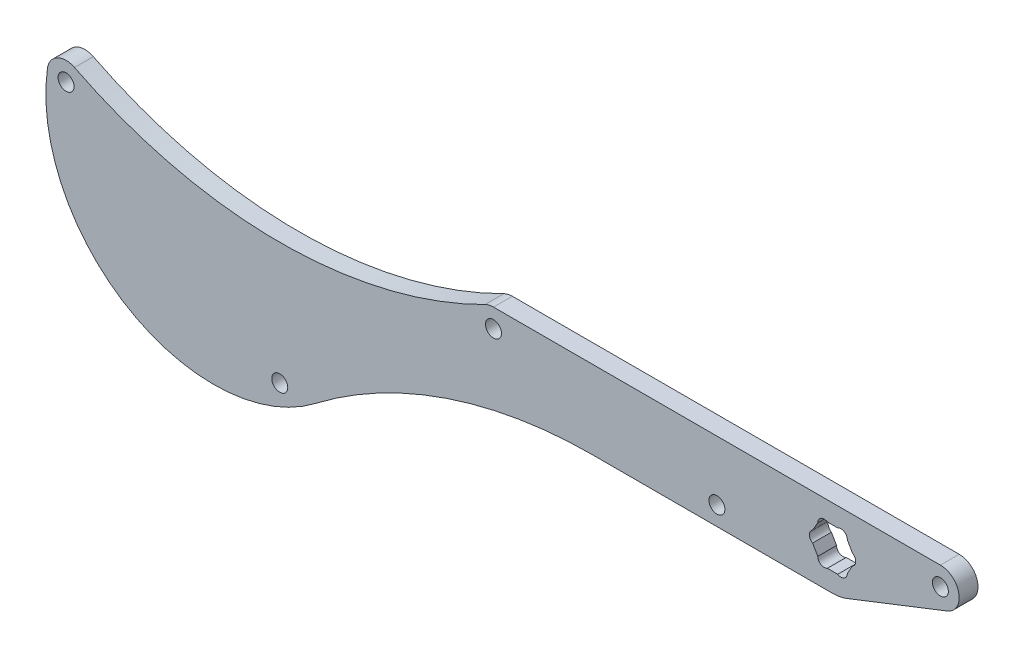
ISO-10303-21;
HEADER;
FILE_DESCRIPTION(('STEP AP214'),'2;1');
FILE_NAME('part.step','',(''),(''),'','','');
FILE_SCHEMA(('AUTOMOTIVE_DESIGN { 1 0 10303 214 1 1 1 1 }'));
ENDSEC;
DATA;
#1=APPLICATION_CONTEXT('core data for automotive mechanical design processes');
#2=APPLICATION_PROTOCOL_DEFINITION('international standard','automotive_design',2000,#1);
#3=PRODUCT_CONTEXT('',#1,'mechanical');
#4=PRODUCT('Part','Part','',(#3));
#5=PRODUCT_RELATED_PRODUCT_CATEGORY('part','',(#4));
#6=PRODUCT_DEFINITION_FORMATION('','',#4);
#7=PRODUCT_DEFINITION_CONTEXT('part definition',#1,'design');
#8=PRODUCT_DEFINITION('design','',#6,#7);
#9=PRODUCT_DEFINITION_SHAPE('','',#8);
#10=(LENGTH_UNIT() NAMED_UNIT(*) SI_UNIT(.MILLI.,.METRE.));
#11=(NAMED_UNIT(*) PLANE_ANGLE_UNIT() SI_UNIT($,.RADIAN.));
#12=(NAMED_UNIT(*) SI_UNIT($,.STERADIAN.) SOLID_ANGLE_UNIT());
#13=UNCERTAINTY_MEASURE_WITH_UNIT(LENGTH_MEASURE(1.E-05),#10,'distance_accuracy_value','');
#14=(GEOMETRIC_REPRESENTATION_CONTEXT(3) GLOBAL_UNCERTAINTY_ASSIGNED_CONTEXT((#13)) GLOBAL_UNIT_ASSIGNED_CONTEXT((#10,
#11,#12)) REPRESENTATION_CONTEXT('',''));
#15=CARTESIAN_POINT('',(0.,0.,0.));
#16=DIRECTION('',(0.,0.,1.));
#17=DIRECTION('',(1.,0.,0.));
#18=AXIS2_PLACEMENT_3D('',#15,#16,#17);
#19=CARTESIAN_POINT('',(89.2636544176856,6.5,-7.5));
#20=DIRECTION('',(0.,0.,1.));
#21=DIRECTION('',(1.,0.,0.));
#22=AXIS2_PLACEMENT_3D('',#19,#20,#21);
#23=PLANE('',#22);
#24=CARTESIAN_POINT('',(192.059712140447,0.,-7.5));
#25=DIRECTION('',(0.,0.,1.));
#26=DIRECTION('',(1.,0.,0.));
#27=AXIS2_PLACEMENT_3D('',#24,#25,#26);
#28=CIRCLE('',#27,2.05000000000001);
#29=CARTESIAN_POINT('',(191.034712140447,1.77535207775811,-7.5));
#30=VERTEX_POINT('',#29);
#31=CARTESIAN_POINT('',(191.034712140447,-1.77535207775809,-7.5));
#32=VERTEX_POINT('',#31);
#33=EDGE_CURVE('E47',#30,#32,#28,.T.);
#34=ORIENTED_EDGE('',*,*,#33,.F.);
#35=DIRECTION('',(-0.500000000000005,-0.866025403784436,0.));
#36=VECTOR('',#35,1.);
#37=CARTESIAN_POINT('',(191.034712140447,1.77535207775811,-7.5));
#38=LINE('',#37,#36);
#39=CARTESIAN_POINT('',(192.679753863261,4.62464792224191,-7.5));
#40=VERTEX_POINT('',#39);
#41=EDGE_CURVE('E226',#40,#30,#38,.T.);
#42=ORIENTED_EDGE('',*,*,#41,.F.);
#43=CARTESIAN_POINT('',(194.729753863261,4.62464792224189,-7.5));
#44=DIRECTION('',(0.,0.,1.));
#45=DIRECTION('',(1.,0.,0.));
#46=AXIS2_PLACEMENT_3D('',#43,#44,#45);
#47=CIRCLE('',#46,2.05);
#48=CARTESIAN_POINT('',(195.754753863261,6.39999999999998,-7.5));
#49=VERTEX_POINT('',#48);
#50=EDGE_CURVE('E223',#49,#40,#47,.T.);
#51=ORIENTED_EDGE('',*,*,#50,.F.);
#52=DIRECTION('',(-1.,0.,0.));
#53=VECTOR('',#52,1.);
#54=CARTESIAN_POINT('',(195.754753863261,6.39999999999999,-7.5));
#55=LINE('',#54,#53);
#56=CARTESIAN_POINT('',(199.044837308888,6.3999999999999,-7.5));
#57=VERTEX_POINT('',#56);
#58=EDGE_CURVE('E220',#57,#49,#55,.T.);
#59=ORIENTED_EDGE('',*,*,#58,.F.);
#60=CARTESIAN_POINT('',(200.069837308888,4.62464792224184,-7.5));
#61=DIRECTION('',(0.,0.,1.));
#62=DIRECTION('',(1.,0.,0.));
#63=AXIS2_PLACEMENT_3D('',#60,#61,#62);
#64=CIRCLE('',#63,2.04999999999998);
#65=CARTESIAN_POINT('',(202.119837308888,4.62464792224182,-7.5));
#66=VERTEX_POINT('',#65);
#67=EDGE_CURVE('E217',#66,#57,#64,.T.);
#68=ORIENTED_EDGE('',*,*,#67,.F.);
#69=DIRECTION('',(-0.499999999999968,0.866025403784457,0.));
#70=VECTOR('',#69,1.);
#71=CARTESIAN_POINT('',(202.119837308888,4.62464792224182,-7.5));
#72=LINE('',#71,#70);
#73=CARTESIAN_POINT('',(203.764879031701,1.77535207775793,-7.5));
#74=VERTEX_POINT('',#73);
#75=EDGE_CURVE('E214',#74,#66,#72,.T.);
#76=ORIENTED_EDGE('',*,*,#75,.F.);
#77=CARTESIAN_POINT('',(202.739879031701,-1.02517827788429E-13,-7.5));
#78=DIRECTION('',(0.,0.,1.));
#79=DIRECTION('',(1.,0.,0.));
#80=AXIS2_PLACEMENT_3D('',#77,#78,#79);
#81=CIRCLE('',#80,2.04999999999995);
#82=CARTESIAN_POINT('',(203.764879031701,-1.77535207775818,-7.5));
#83=VERTEX_POINT('',#82);
#84=EDGE_CURVE('E211',#83,#74,#81,.T.);
#85=ORIENTED_EDGE('',*,*,#84,.F.);
#86=DIRECTION('',(0.500000000000029,0.866025403784422,0.));
#87=VECTOR('',#86,1.);
#88=CARTESIAN_POINT('',(203.764879031701,-1.77535207775822,-7.5));
#89=LINE('',#88,#87);
#90=CARTESIAN_POINT('',(202.119837308888,-4.62464792224203,-7.5));
#91=VERTEX_POINT('',#90);
#92=EDGE_CURVE('E208',#91,#83,#89,.T.);
#93=ORIENTED_EDGE('',*,*,#92,.F.);
#94=CARTESIAN_POINT('',(200.069837308888,-4.62464792224197,-7.5));
#95=DIRECTION('',(0.,0.,1.));
#96=DIRECTION('',(1.,0.,0.));
#97=AXIS2_PLACEMENT_3D('',#94,#95,#96);
#98=CIRCLE('',#97,2.04999999999996);
#99=CARTESIAN_POINT('',(199.044837308888,-6.40000000000002,-7.5));
#100=VERTEX_POINT('',#99);
#101=EDGE_CURVE('E202',#100,#91,#98,.T.);
#102=ORIENTED_EDGE('',*,*,#101,.F.);
#103=DIRECTION('',(1.,0.,0.));
#104=VECTOR('',#103,1.);
#105=CARTESIAN_POINT('',(199.044837308888,-6.40000000000006,-7.5));
#106=LINE('',#105,#104);
#107=CARTESIAN_POINT('',(195.754753863261,-6.40000000000002,-7.5));
#108=VERTEX_POINT('',#107);
#109=EDGE_CURVE('E200',#108,#100,#106,.T.);
#110=ORIENTED_EDGE('',*,*,#109,.F.);
#111=CARTESIAN_POINT('',(194.729753863261,-4.62464792224188,-7.5));
#112=DIRECTION('',(0.,0.,1.));
#113=DIRECTION('',(1.,0.,0.));
#114=AXIS2_PLACEMENT_3D('',#111,#112,#113);
#115=CIRCLE('',#114,2.04999999999999);
#116=CARTESIAN_POINT('',(192.679753863261,-4.62464792224185,-7.5));
#117=VERTEX_POINT('',#116);
#118=EDGE_CURVE('E184',#117,#108,#115,.T.);
#119=ORIENTED_EDGE('',*,*,#118,.F.);
#120=DIRECTION('',(0.499999999999992,-0.866025403784443,0.));
#121=VECTOR('',#120,1.);
#122=CARTESIAN_POINT('',(192.679753863261,-4.62464792224185,-7.5));
#123=LINE('',#122,#121);
#124=EDGE_CURVE('E193',#32,#117,#123,.T.);
#125=ORIENTED_EDGE('',*,*,#124,.F.);
#126=EDGE_LOOP('',(#34,#42,#51,#59,#68,#76,#85,#93,#102,#110,#119,#125));
#127=FACE_BOUND('',#126,.T.);
#128=CARTESIAN_POINT('',(21.1052464968056,-42.5537139426052,-7.5));
#129=DIRECTION('',(0.,0.,1.));
#130=DIRECTION('',(1.,0.,0.));
#131=AXIS2_PLACEMENT_3D('',#128,#129,#130);
#132=CIRCLE('',#131,2.54999999315467);
#133=CARTESIAN_POINT('',(23.6552464899603,-42.5537139426052,-7.5));
#134=VERTEX_POINT('',#133);
#135=EDGE_CURVE('E262',#134,#134,#132,.T.);
#136=ORIENTED_EDGE('',*,*,#135,.F.);
#137=EDGE_LOOP('',(#136));
#138=FACE_BOUND('',#137,.T.);
#139=CARTESIAN_POINT('',(160.527291290898,-6.5,-7.5));
#140=DIRECTION('',(0.,0.,1.));
#141=DIRECTION('',(1.,0.,0.));
#142=AXIS2_PLACEMENT_3D('',#139,#140,#141);
#143=CIRCLE('',#142,2.54999999999999);
#144=CARTESIAN_POINT('',(163.077291290898,-6.5,-7.5));
#145=VERTEX_POINT('',#144);
#146=EDGE_CURVE('E274',#145,#145,#143,.T.);
#147=ORIENTED_EDGE('',*,*,#146,.F.);
#148=EDGE_LOOP('',(#147));
#149=FACE_BOUND('',#148,.T.);
#150=DIRECTION('',(-1.,0.,0.));
#151=VECTOR('',#150,1.);
#152=CARTESIAN_POINT('',(231.79092816411,12.5,-7.5));
#153=LINE('',#152,#151);
#154=CARTESIAN_POINT('',(231.79092816411,12.5,-7.5));
#155=VERTEX_POINT('',#154);
#156=CARTESIAN_POINT('',(89.2636544176856,12.5,-7.5));
#157=VERTEX_POINT('',#156);
#158=EDGE_CURVE('E280',#155,#157,#153,.T.);
#159=ORIENTED_EDGE('',*,*,#158,.T.);
#160=CARTESIAN_POINT('',(89.2636544176856,6.5,-7.5));
#161=DIRECTION('',(0.,0.,1.));
#162=DIRECTION('',(1.,0.,0.));
#163=AXIS2_PLACEMENT_3D('',#160,#161,#162);
#164=CIRCLE('',#163,5.99999999999999);
#165=CARTESIAN_POINT('',(86.564070557482,11.8583810037854,-7.5));
#166=VERTEX_POINT('',#165);
#167=EDGE_CURVE('E282',#157,#166,#164,.T.);
#168=ORIENTED_EDGE('',*,*,#167,.T.);
#169=CARTESIAN_POINT('',(21.1052464968056,141.787043175593,-7.5));
#170=DIRECTION('',(0.,0.,-1.));
#171=DIRECTION('',(1.,0.,0.));
#172=AXIS2_PLACEMENT_3D('',#169,#170,#171);
#173=CIRCLE('',#172,145.486476695129);
#174=CARTESIAN_POINT('',(-44.3535775638708,11.8583810037854,-7.5));
#175=VERTEX_POINT('',#174);
#176=EDGE_CURVE('E285',#166,#175,#173,.T.);
#177=ORIENTED_EDGE('',*,*,#176,.T.);
#178=CARTESIAN_POINT('',(-47.0531614240743,6.50000000000001,-7.5));
#179=DIRECTION('',(0.,0.,1.));
#180=DIRECTION('',(1.,0.,0.));
#181=AXIS2_PLACEMENT_3D('',#178,#179,#180);
#182=CIRCLE('',#181,5.99999999999999);
#183=CARTESIAN_POINT('',(-52.996718656589,7.32105263157895,-7.5));
#184=VERTEX_POINT('',#183);
#185=EDGE_CURVE('E287',#175,#184,#182,.T.);
#186=ORIENTED_EDGE('',*,*,#185,.T.);
#187=CARTESIAN_POINT('',(0.,0.,-7.5));
#188=DIRECTION('',(0.,0.,1.));
#189=DIRECTION('',(1.,0.,0.));
#190=AXIS2_PLACEMENT_3D('',#187,#188,#189);
#191=CIRCLE('',#190,53.5);
#192=CARTESIAN_POINT('',(32.5266850271321,-42.4766378277017,-7.5));
#193=VERTEX_POINT('',#192);
#194=EDGE_CURVE('E289',#184,#193,#191,.T.);
#195=ORIENTED_EDGE('',*,*,#194,.T.);
#196=CARTESIAN_POINT('',(120.978886955537,-157.986476695129,-7.5));
#197=DIRECTION('',(0.,0.,-1.));
#198=DIRECTION('',(1.,0.,0.));
#199=AXIS2_PLACEMENT_3D('',#196,#197,#198);
#200=CIRCLE('',#199,145.486476695129);
#201=CARTESIAN_POINT('',(120.978886955537,-12.5,-7.5));
#202=VERTEX_POINT('',#201);
#203=EDGE_CURVE('E291',#193,#202,#200,.T.);
#204=ORIENTED_EDGE('',*,*,#203,.T.);
#205=DIRECTION('',(1.,0.,0.));
#206=VECTOR('',#205,1.);
#207=CARTESIAN_POINT('',(120.978886955537,-12.5,-7.5));
#208=LINE('',#207,#206);
#209=CARTESIAN_POINT('',(197.399795586074,-12.5,-7.5));
#210=VERTEX_POINT('',#209);
#211=EDGE_CURVE('E293',#202,#210,#208,.T.);
#212=ORIENTED_EDGE('',*,*,#211,.T.);
#213=CARTESIAN_POINT('',(197.399795586074,0.,-7.5));
#214=DIRECTION('',(0.,0.,1.));
#215=DIRECTION('',(1.,0.,0.));
#216=AXIS2_PLACEMENT_3D('',#213,#214,#215);
#217=CIRCLE('',#216,12.5);
#218=CARTESIAN_POINT('',(201.961884601528,-11.6377551020408,-7.5));
#219=VERTEX_POINT('',#218);
#220=EDGE_CURVE('E295',#210,#219,#217,.T.);
#221=ORIENTED_EDGE('',*,*,#220,.T.);
#222=DIRECTION('',(0.931020408163265,0.364967121236292,0.));
#223=VECTOR('',#222,1.);
#224=CARTESIAN_POINT('',(201.961884601528,-11.6377551020408,-7.5));
#225=LINE('',#224,#223);
#226=CARTESIAN_POINT('',(233.980730891527,0.913877551020389,-7.5));
#227=VERTEX_POINT('',#226);
#228=EDGE_CURVE('E297',#219,#227,#225,.T.);
#229=ORIENTED_EDGE('',*,*,#228,.T.);
#230=CARTESIAN_POINT('',(231.79092816411,6.5,-7.5));
#231=DIRECTION('',(0.,0.,1.));
#232=DIRECTION('',(1.,0.,0.));
#233=AXIS2_PLACEMENT_3D('',#230,#231,#232);
#234=CIRCLE('',#233,6.00000000000001);
#235=EDGE_CURVE('E299',#227,#155,#234,.T.);
#236=ORIENTED_EDGE('',*,*,#235,.T.);
#237=EDGE_LOOP('',(#159,#168,#177,#186,#195,#204,#212,#221,#229,#236));
#238=FACE_BOUND('',#237,.T.);
#239=CARTESIAN_POINT('',(89.2636544176856,6.5,-7.5));
#240=DIRECTION('',(0.,0.,1.));
#241=DIRECTION('',(1.,0.,0.));
#242=AXIS2_PLACEMENT_3D('',#239,#240,#241);
#243=CIRCLE('',#242,2.54999999315466);
#244=CARTESIAN_POINT('',(91.8136544108403,6.5,-7.5));
#245=VERTEX_POINT('',#244);
#246=EDGE_CURVE('E268',#245,#245,#243,.T.);
#247=ORIENTED_EDGE('',*,*,#246,.F.);
#248=EDGE_LOOP('',(#247));
#249=FACE_BOUND('',#248,.T.);
#250=CARTESIAN_POINT('',(-47.0531614240743,6.50000000000001,-7.5));
#251=DIRECTION('',(0.,0.,1.));
#252=DIRECTION('',(1.,0.,0.));
#253=AXIS2_PLACEMENT_3D('',#250,#251,#252);
#254=CIRCLE('',#253,2.55);
#255=CARTESIAN_POINT('',(-44.5031614240743,6.50000000000001,-7.5));
#256=VERTEX_POINT('',#255);
#257=EDGE_CURVE('E256',#256,#256,#254,.T.);
#258=ORIENTED_EDGE('',*,*,#257,.F.);
#259=EDGE_LOOP('',(#258));
#260=FACE_BOUND('',#259,.T.);
#261=CARTESIAN_POINT('',(231.79092816411,6.5,-7.5));
#262=DIRECTION('',(0.,0.,1.));
#263=DIRECTION('',(1.,0.,0.));
#264=AXIS2_PLACEMENT_3D('',#261,#262,#263);
#265=CIRCLE('',#264,2.54999999999999);
#266=CARTESIAN_POINT('',(234.34092816411,6.5,-7.5));
#267=VERTEX_POINT('',#266);
#268=EDGE_CURVE('E250',#267,#267,#265,.T.);
#269=ORIENTED_EDGE('',*,*,#268,.F.);
#270=EDGE_LOOP('',(#269));
#271=FACE_BOUND('',#270,.T.);
#272=ADVANCED_FACE('F32',(#127,#138,#149,#238,#249,#260,#271),#23,.T.);
#273=CARTESIAN_POINT('',(89.2636544176856,6.5,-13.5));
#274=DIRECTION('',(0.,0.,1.));
#275=DIRECTION('',(1.,0.,0.));
#276=AXIS2_PLACEMENT_3D('',#273,#274,#275);
#277=PLANE('',#276);
#278=DIRECTION('',(-0.500000000000005,-0.866025403784436,0.));
#279=VECTOR('',#278,1.);
#280=CARTESIAN_POINT('',(167.637780272056,-38.7493226595228,-13.5));
#281=LINE('',#280,#279);
#282=CARTESIAN_POINT('',(192.679753863261,4.62464792224191,-13.5));
#283=VERTEX_POINT('',#282);
#284=CARTESIAN_POINT('',(191.034712140447,1.77535207775811,-13.5));
#285=VERTEX_POINT('',#284);
#286=EDGE_CURVE('E40',#283,#285,#281,.T.);
#287=ORIENTED_EDGE('',*,*,#286,.T.);
#288=CARTESIAN_POINT('',(192.059712140447,0.,-13.5));
#289=DIRECTION('',(0.,0.,1.));
#290=DIRECTION('',(1.,0.,0.));
#291=AXIS2_PLACEMENT_3D('',#288,#289,#290);
#292=CIRCLE('',#291,2.05000000000001);
#293=CARTESIAN_POINT('',(191.034712140447,-1.77535207775809,-13.5));
#294=VERTEX_POINT('',#293);
#295=EDGE_CURVE('E11',#285,#294,#292,.T.);
#296=ORIENTED_EDGE('',*,*,#295,.T.);
#297=DIRECTION('',(0.499999999999992,-0.866025403784443,0.));
#298=VECTOR('',#297,1.);
#299=CARTESIAN_POINT('',(162.008615147458,48.499322659522,-13.5));
#300=LINE('',#299,#298);
#301=CARTESIAN_POINT('',(192.679753863261,-4.62464792224185,-13.5));
#302=VERTEX_POINT('',#301);
#303=EDGE_CURVE('E350',#294,#302,#300,.T.);
#304=ORIENTED_EDGE('',*,*,#303,.T.);
#305=CARTESIAN_POINT('',(194.729753863261,-4.62464792224188,-13.5));
#306=DIRECTION('',(0.,0.,1.));
#307=DIRECTION('',(1.,0.,0.));
#308=AXIS2_PLACEMENT_3D('',#305,#306,#307);
#309=CIRCLE('',#308,2.04999999999999);
#310=CARTESIAN_POINT('',(195.754753863261,-6.40000000000002,-13.5));
#311=VERTEX_POINT('',#310);
#312=EDGE_CURVE('E187',#302,#311,#309,.T.);
#313=ORIENTED_EDGE('',*,*,#312,.T.);
#314=DIRECTION('',(1.,0.,0.));
#315=VECTOR('',#314,1.);
#316=CARTESIAN_POINT('',(89.2636544176855,-6.39999999999878,-13.5));
#317=LINE('',#316,#315);
#318=CARTESIAN_POINT('',(199.044837308888,-6.40000000000002,-13.5));
#319=VERTEX_POINT('',#318);
#320=EDGE_CURVE('E353',#311,#319,#317,.T.);
#321=ORIENTED_EDGE('',*,*,#320,.T.);
#322=CARTESIAN_POINT('',(200.069837308888,-4.62464792224197,-13.5));
#323=DIRECTION('',(0.,0.,1.));
#324=DIRECTION('',(1.,0.,0.));
#325=AXIS2_PLACEMENT_3D('',#322,#323,#324);
#326=CIRCLE('',#325,2.04999999999996);
#327=CARTESIAN_POINT('',(202.119837308888,-4.62464792224203,-13.5));
#328=VERTEX_POINT('',#327);
#329=EDGE_CURVE('E356',#319,#328,#326,.T.);
#330=ORIENTED_EDGE('',*,*,#329,.T.);
#331=DIRECTION('',(0.500000000000029,0.866025403784422,0.));
#332=VECTOR('',#331,1.);
#333=CARTESIAN_POINT('',(178.722905440494,-45.1493226595246,-13.5));
#334=LINE('',#333,#332);
#335=CARTESIAN_POINT('',(203.764879031701,-1.77535207775818,-13.5));
#336=VERTEX_POINT('',#335);
#337=EDGE_CURVE('E359',#328,#336,#334,.T.);
#338=ORIENTED_EDGE('',*,*,#337,.T.);
#339=CARTESIAN_POINT('',(202.739879031701,-1.02517827788429E-13,-13.5));
#340=DIRECTION('',(0.,0.,1.));
#341=DIRECTION('',(1.,0.,0.));
#342=AXIS2_PLACEMENT_3D('',#339,#340,#341);
#343=CIRCLE('',#342,2.04999999999995);
#344=CARTESIAN_POINT('',(203.764879031701,1.77535207775793,-13.5));
#345=VERTEX_POINT('',#344);
#346=EDGE_CURVE('E362',#336,#345,#343,.T.);
#347=ORIENTED_EDGE('',*,*,#346,.T.);
#348=DIRECTION('',(-0.499999999999968,0.866025403784457,0.));
#349=VECTOR('',#348,1.);
#350=CARTESIAN_POINT('',(173.093740315902,54.8993226595204,-13.5));
#351=LINE('',#350,#349);
#352=CARTESIAN_POINT('',(202.119837308888,4.62464792224182,-13.5));
#353=VERTEX_POINT('',#352);
#354=EDGE_CURVE('E365',#345,#353,#351,.T.);
#355=ORIENTED_EDGE('',*,*,#354,.T.);
#356=CARTESIAN_POINT('',(200.069837308888,4.62464792224184,-13.5));
#357=DIRECTION('',(0.,0.,1.));
#358=DIRECTION('',(1.,0.,0.));
#359=AXIS2_PLACEMENT_3D('',#356,#357,#358);
#360=CIRCLE('',#359,2.04999999999998);
#361=CARTESIAN_POINT('',(199.044837308888,6.3999999999999,-13.5));
#362=VERTEX_POINT('',#361);
#363=EDGE_CURVE('E368',#353,#362,#360,.T.);
#364=ORIENTED_EDGE('',*,*,#363,.T.);
#365=DIRECTION('',(-1.,0.,0.));
#366=VECTOR('',#365,1.);
#367=CARTESIAN_POINT('',(89.2636544176856,6.40000000000282,-13.5));
#368=LINE('',#367,#366);
#369=CARTESIAN_POINT('',(195.754753863261,6.39999999999998,-13.5));
#370=VERTEX_POINT('',#369);
#371=EDGE_CURVE('E371',#362,#370,#368,.T.);
#372=ORIENTED_EDGE('',*,*,#371,.T.);
#373=CARTESIAN_POINT('',(194.729753863261,4.62464792224189,-13.5));
#374=DIRECTION('',(0.,0.,1.));
#375=DIRECTION('',(1.,0.,0.));
#376=AXIS2_PLACEMENT_3D('',#373,#374,#375);
#377=CIRCLE('',#376,2.05);
#378=EDGE_CURVE('E374',#370,#283,#377,.T.);
#379=ORIENTED_EDGE('',*,*,#378,.T.);
#380=EDGE_LOOP('',(#287,#296,#304,#313,#321,#330,#338,#347,#355,#364,#372,#379));
#381=FACE_BOUND('',#380,.T.);
#382=DIRECTION('',(-1.,0.,0.));
#383=VECTOR('',#382,1.);
#384=CARTESIAN_POINT('',(197.399795586074,12.5,-13.5));
#385=LINE('',#384,#383);
#386=CARTESIAN_POINT('',(231.79092816411,12.5,-13.5));
#387=VERTEX_POINT('',#386);
#388=CARTESIAN_POINT('',(89.2636544176856,12.5,-13.5));
#389=VERTEX_POINT('',#388);
#390=EDGE_CURVE('E277',#387,#389,#385,.T.);
#391=ORIENTED_EDGE('',*,*,#390,.F.);
#392=CARTESIAN_POINT('',(231.79092816411,6.5,-13.5));
#393=DIRECTION('',(0.,0.,1.));
#394=DIRECTION('',(1.,0.,0.));
#395=AXIS2_PLACEMENT_3D('',#392,#393,#394);
#396=CIRCLE('',#395,6.00000000000001);
#397=CARTESIAN_POINT('',(233.980730891527,0.913877551020389,-13.5));
#398=VERTEX_POINT('',#397);
#399=EDGE_CURVE('E283',#398,#387,#396,.T.);
#400=ORIENTED_EDGE('',*,*,#399,.F.);
#401=DIRECTION('',(0.931020408163265,0.364967121236292,0.));
#402=VECTOR('',#401,1.);
#403=CARTESIAN_POINT('',(201.961884601528,-11.6377551020408,-13.5));
#404=LINE('',#403,#402);
#405=CARTESIAN_POINT('',(201.961884601528,-11.6377551020408,-13.5));
#406=VERTEX_POINT('',#405);
#407=EDGE_CURVE('E317',#406,#398,#404,.T.);
#408=ORIENTED_EDGE('',*,*,#407,.F.);
#409=CARTESIAN_POINT('',(197.399795586074,0.,-13.5));
#410=DIRECTION('',(0.,0.,1.));
#411=DIRECTION('',(1.,0.,0.));
#412=AXIS2_PLACEMENT_3D('',#409,#410,#411);
#413=CIRCLE('',#412,12.5);
#414=CARTESIAN_POINT('',(197.399795586074,-12.5,-13.5));
#415=VERTEX_POINT('',#414);
#416=EDGE_CURVE('E315',#415,#406,#413,.T.);
#417=ORIENTED_EDGE('',*,*,#416,.F.);
#418=DIRECTION('',(1.,0.,0.));
#419=VECTOR('',#418,1.);
#420=CARTESIAN_POINT('',(120.978886955537,-12.5,-13.5));
#421=LINE('',#420,#419);
#422=CARTESIAN_POINT('',(120.978886955537,-12.5,-13.5));
#423=VERTEX_POINT('',#422);
#424=EDGE_CURVE('E313',#423,#415,#421,.T.);
#425=ORIENTED_EDGE('',*,*,#424,.F.);
#426=CARTESIAN_POINT('',(120.978886955537,-157.986476695129,-13.5));
#427=DIRECTION('',(0.,0.,-1.));
#428=DIRECTION('',(1.,0.,0.));
#429=AXIS2_PLACEMENT_3D('',#426,#427,#428);
#430=CIRCLE('',#429,145.486476695129);
#431=CARTESIAN_POINT('',(32.5266850271321,-42.4766378277017,-13.5));
#432=VERTEX_POINT('',#431);
#433=EDGE_CURVE('E311',#432,#423,#430,.T.);
#434=ORIENTED_EDGE('',*,*,#433,.F.);
#435=CARTESIAN_POINT('',(0.,0.,-13.5));
#436=DIRECTION('',(0.,0.,1.));
#437=DIRECTION('',(1.,0.,0.));
#438=AXIS2_PLACEMENT_3D('',#435,#436,#437);
#439=CIRCLE('',#438,53.5);
#440=CARTESIAN_POINT('',(-52.996718656589,7.32105263157895,-13.5));
#441=VERTEX_POINT('',#440);
#442=EDGE_CURVE('E309',#441,#432,#439,.T.);
#443=ORIENTED_EDGE('',*,*,#442,.F.);
#444=CARTESIAN_POINT('',(-47.0531614240743,6.50000000000001,-13.5));
#445=DIRECTION('',(0.,0.,1.));
#446=DIRECTION('',(1.,0.,0.));
#447=AXIS2_PLACEMENT_3D('',#444,#445,#446);
#448=CIRCLE('',#447,5.99999999999999);
#449=CARTESIAN_POINT('',(-44.3535775638708,11.8583810037854,-13.5));
#450=VERTEX_POINT('',#449);
#451=EDGE_CURVE('E307',#450,#441,#448,.T.);
#452=ORIENTED_EDGE('',*,*,#451,.F.);
#453=CARTESIAN_POINT('',(21.1052464968056,141.787043175593,-13.5));
#454=DIRECTION('',(0.,0.,-1.));
#455=DIRECTION('',(1.,0.,0.));
#456=AXIS2_PLACEMENT_3D('',#453,#454,#455);
#457=CIRCLE('',#456,145.486476695129);
#458=CARTESIAN_POINT('',(86.564070557482,11.8583810037854,-13.5));
#459=VERTEX_POINT('',#458);
#460=EDGE_CURVE('E305',#459,#450,#457,.T.);
#461=ORIENTED_EDGE('',*,*,#460,.F.);
#462=CARTESIAN_POINT('',(89.2636544176856,6.5,-13.5));
#463=DIRECTION('',(0.,0.,1.));
#464=DIRECTION('',(1.,0.,0.));
#465=AXIS2_PLACEMENT_3D('',#462,#463,#464);
#466=CIRCLE('',#465,5.99999999999999);
#467=EDGE_CURVE('E303',#389,#459,#466,.T.);
#468=ORIENTED_EDGE('',*,*,#467,.F.);
#469=EDGE_LOOP('',(#391,#400,#408,#417,#425,#434,#443,#452,#461,#468));
#470=FACE_BOUND('',#469,.T.);
#471=CARTESIAN_POINT('',(160.527291290898,-6.5,-13.5));
#472=DIRECTION('',(0.,0.,1.));
#473=DIRECTION('',(1.,0.,0.));
#474=AXIS2_PLACEMENT_3D('',#471,#472,#473);
#475=CIRCLE('',#474,2.54999999999999);
#476=CARTESIAN_POINT('',(163.077291290898,-6.5,-13.5));
#477=VERTEX_POINT('',#476);
#478=EDGE_CURVE('E271',#477,#477,#475,.T.);
#479=ORIENTED_EDGE('',*,*,#478,.T.);
#480=EDGE_LOOP('',(#479));
#481=FACE_BOUND('',#480,.T.);
#482=CARTESIAN_POINT('',(89.2636544176856,6.5,-13.5));
#483=DIRECTION('',(0.,0.,1.));
#484=DIRECTION('',(1.,0.,0.));
#485=AXIS2_PLACEMENT_3D('',#482,#483,#484);
#486=CIRCLE('',#485,2.54999999315466);
#487=CARTESIAN_POINT('',(91.8136544108403,6.5,-13.5));
#488=VERTEX_POINT('',#487);
#489=EDGE_CURVE('E265',#488,#488,#486,.T.);
#490=ORIENTED_EDGE('',*,*,#489,.T.);
#491=EDGE_LOOP('',(#490));
#492=FACE_BOUND('',#491,.T.);
#493=CARTESIAN_POINT('',(21.1052464968056,-42.5537139426052,-13.5));
#494=DIRECTION('',(0.,0.,1.));
#495=DIRECTION('',(1.,0.,0.));
#496=AXIS2_PLACEMENT_3D('',#493,#494,#495);
#497=CIRCLE('',#496,2.54999999315467);
#498=CARTESIAN_POINT('',(23.6552464899603,-42.5537139426052,-13.5));
#499=VERTEX_POINT('',#498);
#500=EDGE_CURVE('E259',#499,#499,#497,.T.);
#501=ORIENTED_EDGE('',*,*,#500,.T.);
#502=EDGE_LOOP('',(#501));
#503=FACE_BOUND('',#502,.T.);
#504=CARTESIAN_POINT('',(-47.0531614240743,6.50000000000001,-13.5));
#505=DIRECTION('',(0.,0.,1.));
#506=DIRECTION('',(1.,0.,0.));
#507=AXIS2_PLACEMENT_3D('',#504,#505,#506);
#508=CIRCLE('',#507,2.55);
#509=CARTESIAN_POINT('',(-44.5031614240743,6.50000000000001,-13.5));
#510=VERTEX_POINT('',#509);
#511=EDGE_CURVE('E253',#510,#510,#508,.T.);
#512=ORIENTED_EDGE('',*,*,#511,.T.);
#513=EDGE_LOOP('',(#512));
#514=FACE_BOUND('',#513,.T.);
#515=CARTESIAN_POINT('',(231.79092816411,6.5,-13.5));
#516=DIRECTION('',(0.,0.,1.));
#517=DIRECTION('',(1.,0.,0.));
#518=AXIS2_PLACEMENT_3D('',#515,#516,#517);
#519=CIRCLE('',#518,2.54999999999999);
#520=CARTESIAN_POINT('',(234.34092816411,6.5,-13.5));
#521=VERTEX_POINT('',#520);
#522=EDGE_CURVE('E231',#521,#521,#519,.T.);
#523=ORIENTED_EDGE('',*,*,#522,.T.);
#524=EDGE_LOOP('',(#523));
#525=FACE_BOUND('',#524,.T.);
#526=ADVANCED_FACE('F378',(#381,#470,#481,#492,#503,#514,#525),#277,.F.);
#527=CARTESIAN_POINT('',(197.399795586074,12.5,-7.5));
#528=DIRECTION('',(0.,-1.,0.));
#529=DIRECTION('',(1.,0.,0.));
#530=AXIS2_PLACEMENT_3D('',#527,#528,#529);
#531=PLANE('',#530);
#532=ORIENTED_EDGE('',*,*,#390,.T.);
#533=DIRECTION('',(0.,0.,-1.));
#534=VECTOR('',#533,1.);
#535=CARTESIAN_POINT('',(89.2636544176856,12.5,-7.5));
#536=LINE('',#535,#534);
#537=EDGE_CURVE('E347',#157,#389,#536,.T.);
#538=ORIENTED_EDGE('',*,*,#537,.F.);
#539=ORIENTED_EDGE('',*,*,#158,.F.);
#540=DIRECTION('',(0.,0.,-1.));
#541=VECTOR('',#540,1.);
#542=CARTESIAN_POINT('',(231.79092816411,12.5,-7.5));
#543=LINE('',#542,#541);
#544=EDGE_CURVE('E301',#155,#387,#543,.T.);
#545=ORIENTED_EDGE('',*,*,#544,.T.);
#546=EDGE_LOOP('',(#532,#538,#539,#545));
#547=FACE_BOUND('',#546,.T.);
#548=ADVANCED_FACE('F34',(#547),#531,.F.);
#549=CARTESIAN_POINT('',(89.2636544176856,6.5,-7.5));
#550=DIRECTION('',(0.,0.,-1.));
#551=DIRECTION('',(-1.,0.,0.));
#552=AXIS2_PLACEMENT_3D('',#549,#550,#551);
#553=CYLINDRICAL_SURFACE('',#552,5.99999999999999);
#554=ORIENTED_EDGE('',*,*,#467,.T.);
#555=DIRECTION('',(0.,0.,-1.));
#556=VECTOR('',#555,1.);
#557=CARTESIAN_POINT('',(86.564070557482,11.8583810037854,-7.5));
#558=LINE('',#557,#556);
#559=EDGE_CURVE('E344',#166,#459,#558,.T.);
#560=ORIENTED_EDGE('',*,*,#559,.F.);
#561=ORIENTED_EDGE('',*,*,#167,.F.);
#562=ORIENTED_EDGE('',*,*,#537,.T.);
#563=EDGE_LOOP('',(#554,#560,#561,#562));
#564=FACE_BOUND('',#563,.T.);
#565=ADVANCED_FACE('F467',(#564),#553,.T.);
#566=CARTESIAN_POINT('',(21.1052464968056,141.787043175593,-7.5));
#567=DIRECTION('',(0.,0.,-1.));
#568=DIRECTION('',(-1.,0.,0.));
#569=AXIS2_PLACEMENT_3D('',#566,#567,#568);
#570=CYLINDRICAL_SURFACE('',#569,145.486476695129);
#571=ORIENTED_EDGE('',*,*,#460,.T.);
#572=DIRECTION('',(0.,0.,-1.));
#573=VECTOR('',#572,1.);
#574=CARTESIAN_POINT('',(-44.3535775638708,11.8583810037854,-7.5));
#575=LINE('',#574,#573);
#576=EDGE_CURVE('E341',#175,#450,#575,.T.);
#577=ORIENTED_EDGE('',*,*,#576,.F.);
#578=ORIENTED_EDGE('',*,*,#176,.F.);
#579=ORIENTED_EDGE('',*,*,#559,.T.);
#580=EDGE_LOOP('',(#571,#577,#578,#579));
#581=FACE_BOUND('',#580,.T.);
#582=ADVANCED_FACE('F464',(#581),#570,.F.);
#583=CARTESIAN_POINT('',(-47.0531614240743,6.50000000000001,-7.5));
#584=DIRECTION('',(0.,0.,-1.));
#585=DIRECTION('',(-1.,0.,0.));
#586=AXIS2_PLACEMENT_3D('',#583,#584,#585);
#587=CYLINDRICAL_SURFACE('',#586,5.99999999999999);
#588=ORIENTED_EDGE('',*,*,#451,.T.);
#589=DIRECTION('',(0.,0.,-1.));
#590=VECTOR('',#589,1.);
#591=CARTESIAN_POINT('',(-52.996718656589,7.32105263157895,-7.5));
#592=LINE('',#591,#590);
#593=EDGE_CURVE('E338',#184,#441,#592,.T.);
#594=ORIENTED_EDGE('',*,*,#593,.F.);
#595=ORIENTED_EDGE('',*,*,#185,.F.);
#596=ORIENTED_EDGE('',*,*,#576,.T.);
#597=EDGE_LOOP('',(#588,#594,#595,#596));
#598=FACE_BOUND('',#597,.T.);
#599=ADVANCED_FACE('F460',(#598),#587,.T.);
#600=CARTESIAN_POINT('',(0.,0.,-7.5));
#601=DIRECTION('',(0.,0.,-1.));
#602=DIRECTION('',(-1.,0.,0.));
#603=AXIS2_PLACEMENT_3D('',#600,#601,#602);
#604=CYLINDRICAL_SURFACE('',#603,53.5);
#605=ORIENTED_EDGE('',*,*,#442,.T.);
#606=DIRECTION('',(0.,0.,-1.));
#607=VECTOR('',#606,1.);
#608=CARTESIAN_POINT('',(32.5266850271321,-42.4766378277017,-7.5));
#609=LINE('',#608,#607);
#610=EDGE_CURVE('E335',#193,#432,#609,.T.);
#611=ORIENTED_EDGE('',*,*,#610,.F.);
#612=ORIENTED_EDGE('',*,*,#194,.F.);
#613=ORIENTED_EDGE('',*,*,#593,.T.);
#614=EDGE_LOOP('',(#605,#611,#612,#613));
#615=FACE_BOUND('',#614,.T.);
#616=ADVANCED_FACE('F456',(#615),#604,.T.);
#617=CARTESIAN_POINT('',(120.978886955537,-157.986476695129,-7.5));
#618=DIRECTION('',(0.,0.,-1.));
#619=DIRECTION('',(-1.,0.,0.));
#620=AXIS2_PLACEMENT_3D('',#617,#618,#619);
#621=CYLINDRICAL_SURFACE('',#620,145.486476695129);
#622=ORIENTED_EDGE('',*,*,#433,.T.);
#623=DIRECTION('',(0.,0.,-1.));
#624=VECTOR('',#623,1.);
#625=CARTESIAN_POINT('',(120.978886955537,-12.5,-7.5));
#626=LINE('',#625,#624);
#627=EDGE_CURVE('E332',#202,#423,#626,.T.);
#628=ORIENTED_EDGE('',*,*,#627,.F.);
#629=ORIENTED_EDGE('',*,*,#203,.F.);
#630=ORIENTED_EDGE('',*,*,#610,.T.);
#631=EDGE_LOOP('',(#622,#628,#629,#630));
#632=FACE_BOUND('',#631,.T.);
#633=ADVANCED_FACE('F452',(#632),#621,.F.);
#634=CARTESIAN_POINT('',(120.978886955537,-12.5,-7.5));
#635=DIRECTION('',(0.,1.,0.));
#636=DIRECTION('',(-1.,0.,0.));
#637=AXIS2_PLACEMENT_3D('',#634,#635,#636);
#638=PLANE('',#637);
#639=ORIENTED_EDGE('',*,*,#424,.T.);
#640=DIRECTION('',(0.,0.,-1.));
#641=VECTOR('',#640,1.);
#642=CARTESIAN_POINT('',(197.399795586074,-12.5,-7.5));
#643=LINE('',#642,#641);
#644=EDGE_CURVE('E329',#210,#415,#643,.T.);
#645=ORIENTED_EDGE('',*,*,#644,.F.);
#646=ORIENTED_EDGE('',*,*,#211,.F.);
#647=ORIENTED_EDGE('',*,*,#627,.T.);
#648=EDGE_LOOP('',(#639,#645,#646,#647));
#649=FACE_BOUND('',#648,.T.);
#650=ADVANCED_FACE('F448',(#649),#638,.F.);
#651=CARTESIAN_POINT('',(197.399795586074,0.,-7.5));
#652=DIRECTION('',(0.,0.,-1.));
#653=DIRECTION('',(-1.,0.,0.));
#654=AXIS2_PLACEMENT_3D('',#651,#652,#653);
#655=CYLINDRICAL_SURFACE('',#654,12.5);
#656=ORIENTED_EDGE('',*,*,#416,.T.);
#657=DIRECTION('',(0.,0.,-1.));
#658=VECTOR('',#657,1.);
#659=CARTESIAN_POINT('',(201.961884601528,-11.6377551020408,-7.5));
#660=LINE('',#659,#658);
#661=EDGE_CURVE('E326',#219,#406,#660,.T.);
#662=ORIENTED_EDGE('',*,*,#661,.F.);
#663=ORIENTED_EDGE('',*,*,#220,.F.);
#664=ORIENTED_EDGE('',*,*,#644,.T.);
#665=EDGE_LOOP('',(#656,#662,#663,#664));
#666=FACE_BOUND('',#665,.T.);
#667=ADVANCED_FACE('F444',(#666),#655,.T.);
#668=CARTESIAN_POINT('',(201.961884601528,-11.6377551020408,-7.5));
#669=DIRECTION('',(-0.364967121236292,0.931020408163265,0.));
#670=DIRECTION('',(-0.931020408163265,-0.364967121236292,0.));
#671=AXIS2_PLACEMENT_3D('',#668,#669,#670);
#672=PLANE('',#671);
#673=ORIENTED_EDGE('',*,*,#407,.T.);
#674=DIRECTION('',(0.,0.,-1.));
#675=VECTOR('',#674,1.);
#676=CARTESIAN_POINT('',(233.980730891527,0.913877551020389,-7.5));
#677=LINE('',#676,#675);
#678=EDGE_CURVE('E323',#227,#398,#677,.T.);
#679=ORIENTED_EDGE('',*,*,#678,.F.);
#680=ORIENTED_EDGE('',*,*,#228,.F.);
#681=ORIENTED_EDGE('',*,*,#661,.T.);
#682=EDGE_LOOP('',(#673,#679,#680,#681));
#683=FACE_BOUND('',#682,.T.);
#684=ADVANCED_FACE('F440',(#683),#672,.F.);
#685=CARTESIAN_POINT('',(231.79092816411,6.5,-7.5));
#686=DIRECTION('',(0.,0.,-1.));
#687=DIRECTION('',(-1.,0.,0.));
#688=AXIS2_PLACEMENT_3D('',#685,#686,#687);
#689=CYLINDRICAL_SURFACE('',#688,6.00000000000001);
#690=ORIENTED_EDGE('',*,*,#399,.T.);
#691=ORIENTED_EDGE('',*,*,#544,.F.);
#692=ORIENTED_EDGE('',*,*,#235,.F.);
#693=ORIENTED_EDGE('',*,*,#678,.T.);
#694=EDGE_LOOP('',(#690,#691,#692,#693));
#695=FACE_BOUND('',#694,.T.);
#696=ADVANCED_FACE('F437',(#695),#689,.T.);
#697=CARTESIAN_POINT('',(160.527291290898,-6.5,-7.5));
#698=DIRECTION('',(0.,0.,-1.));
#699=DIRECTION('',(-1.,0.,0.));
#700=AXIS2_PLACEMENT_3D('',#697,#698,#699);
#701=CYLINDRICAL_SURFACE('',#700,2.54999999999999);
#702=ORIENTED_EDGE('',*,*,#146,.T.);
#703=EDGE_LOOP('',(#702));
#704=FACE_BOUND('',#703,.T.);
#705=ORIENTED_EDGE('',*,*,#478,.F.);
#706=EDGE_LOOP('',(#705));
#707=FACE_BOUND('',#706,.T.);
#708=ADVANCED_FACE('F434',(#704,#707),#701,.F.);
#709=CARTESIAN_POINT('',(89.2636544176856,6.5,-7.5));
#710=DIRECTION('',(0.,0.,-1.));
#711=DIRECTION('',(-1.,0.,0.));
#712=AXIS2_PLACEMENT_3D('',#709,#710,#711);
#713=CYLINDRICAL_SURFACE('',#712,2.54999999315466);
#714=ORIENTED_EDGE('',*,*,#246,.T.);
#715=EDGE_LOOP('',(#714));
#716=FACE_BOUND('',#715,.T.);
#717=ORIENTED_EDGE('',*,*,#489,.F.);
#718=EDGE_LOOP('',(#717));
#719=FACE_BOUND('',#718,.T.);
#720=ADVANCED_FACE('F525',(#716,#719),#713,.F.);
#721=CARTESIAN_POINT('',(21.1052464968056,-42.5537139426052,-7.5));
#722=DIRECTION('',(0.,0.,-1.));
#723=DIRECTION('',(-1.,0.,0.));
#724=AXIS2_PLACEMENT_3D('',#721,#722,#723);
#725=CYLINDRICAL_SURFACE('',#724,2.54999999315467);
#726=ORIENTED_EDGE('',*,*,#135,.T.);
#727=EDGE_LOOP('',(#726));
#728=FACE_BOUND('',#727,.T.);
#729=ORIENTED_EDGE('',*,*,#500,.F.);
#730=EDGE_LOOP('',(#729));
#731=FACE_BOUND('',#730,.T.);
#732=ADVANCED_FACE('F518',(#728,#731),#725,.F.);
#733=CARTESIAN_POINT('',(-47.0531614240743,6.50000000000001,-7.5));
#734=DIRECTION('',(0.,0.,-1.));
#735=DIRECTION('',(-1.,0.,0.));
#736=AXIS2_PLACEMENT_3D('',#733,#734,#735);
#737=CYLINDRICAL_SURFACE('',#736,2.55);
#738=ORIENTED_EDGE('',*,*,#257,.T.);
#739=EDGE_LOOP('',(#738));
#740=FACE_BOUND('',#739,.T.);
#741=ORIENTED_EDGE('',*,*,#511,.F.);
#742=EDGE_LOOP('',(#741));
#743=FACE_BOUND('',#742,.T.);
#744=ADVANCED_FACE('F423',(#740,#743),#737,.F.);
#745=CARTESIAN_POINT('',(231.79092816411,6.5,-7.5));
#746=DIRECTION('',(0.,0.,-1.));
#747=DIRECTION('',(-1.,0.,0.));
#748=AXIS2_PLACEMENT_3D('',#745,#746,#747);
#749=CYLINDRICAL_SURFACE('',#748,2.54999999999999);
#750=ORIENTED_EDGE('',*,*,#268,.T.);
#751=EDGE_LOOP('',(#750));
#752=FACE_BOUND('',#751,.T.);
#753=ORIENTED_EDGE('',*,*,#522,.F.);
#754=EDGE_LOOP('',(#753));
#755=FACE_BOUND('',#754,.T.);
#756=ADVANCED_FACE('F416',(#752,#755),#749,.F.);
#757=CARTESIAN_POINT('',(192.059712140447,0.,-17.5));
#758=DIRECTION('',(0.,0.,1.));
#759=DIRECTION('',(1.,0.,0.));
#760=AXIS2_PLACEMENT_3D('',#757,#758,#759);
#761=CYLINDRICAL_SURFACE('',#760,2.05000000000001);
#762=DIRECTION('',(0.,0.,1.));
#763=VECTOR('',#762,1.);
#764=CARTESIAN_POINT('',(191.034712140447,1.77535207775811,-17.5));
#765=LINE('',#764,#763);
#766=EDGE_CURVE('E229',#285,#30,#765,.T.);
#767=ORIENTED_EDGE('',*,*,#766,.T.);
#768=ORIENTED_EDGE('',*,*,#33,.T.);
#769=DIRECTION('',(0.,0.,1.));
#770=VECTOR('',#769,1.);
#771=CARTESIAN_POINT('',(191.034712140447,-1.77535207775809,-17.5));
#772=LINE('',#771,#770);
#773=EDGE_CURVE('E190',#294,#32,#772,.T.);
#774=ORIENTED_EDGE('',*,*,#773,.F.);
#775=ORIENTED_EDGE('',*,*,#295,.F.);
#776=EDGE_LOOP('',(#767,#768,#774,#775));
#777=FACE_BOUND('',#776,.T.);
#778=ADVANCED_FACE('F414',(#777),#761,.F.);
#779=CARTESIAN_POINT('',(191.034712140447,1.77535207775811,-17.5));
#780=DIRECTION('',(-0.866025403784436,0.500000000000005,0.));
#781=DIRECTION('',(-0.500000000000005,-0.866025403784436,0.));
#782=AXIS2_PLACEMENT_3D('',#779,#780,#781);
#783=PLANE('',#782);
#784=DIRECTION('',(0.,0.,1.));
#785=VECTOR('',#784,1.);
#786=CARTESIAN_POINT('',(192.679753863261,4.62464792224191,-17.5));
#787=LINE('',#786,#785);
#788=EDGE_CURVE('E232',#283,#40,#787,.T.);
#789=ORIENTED_EDGE('',*,*,#788,.T.);
#790=ORIENTED_EDGE('',*,*,#41,.T.);
#791=ORIENTED_EDGE('',*,*,#766,.F.);
#792=ORIENTED_EDGE('',*,*,#286,.F.);
#793=EDGE_LOOP('',(#789,#790,#791,#792));
#794=FACE_BOUND('',#793,.T.);
#795=ADVANCED_FACE('F383',(#794),#783,.F.);
#796=CARTESIAN_POINT('',(194.729753863261,4.62464792224189,-17.5));
#797=DIRECTION('',(0.,0.,1.));
#798=DIRECTION('',(1.,0.,0.));
#799=AXIS2_PLACEMENT_3D('',#796,#797,#798);
#800=CYLINDRICAL_SURFACE('',#799,2.05);
#801=DIRECTION('',(0.,0.,1.));
#802=VECTOR('',#801,1.);
#803=CARTESIAN_POINT('',(195.754753863261,6.39999999999998,-17.5));
#804=LINE('',#803,#802);
#805=EDGE_CURVE('E234',#370,#49,#804,.T.);
#806=ORIENTED_EDGE('',*,*,#805,.T.);
#807=ORIENTED_EDGE('',*,*,#50,.T.);
#808=ORIENTED_EDGE('',*,*,#788,.F.);
#809=ORIENTED_EDGE('',*,*,#378,.F.);
#810=EDGE_LOOP('',(#806,#807,#808,#809));
#811=FACE_BOUND('',#810,.T.);
#812=ADVANCED_FACE('F385',(#811),#800,.F.);
#813=CARTESIAN_POINT('',(195.754753863261,6.39999999999999,-17.5));
#814=DIRECTION('',(0.,1.,0.));
#815=DIRECTION('',(-1.,0.,0.));
#816=AXIS2_PLACEMENT_3D('',#813,#814,#815);
#817=PLANE('',#816);
#818=DIRECTION('',(0.,0.,1.));
#819=VECTOR('',#818,1.);
#820=CARTESIAN_POINT('',(199.044837308888,6.3999999999999,-17.5));
#821=LINE('',#820,#819);
#822=EDGE_CURVE('E236',#362,#57,#821,.T.);
#823=ORIENTED_EDGE('',*,*,#822,.T.);
#824=ORIENTED_EDGE('',*,*,#58,.T.);
#825=ORIENTED_EDGE('',*,*,#805,.F.);
#826=ORIENTED_EDGE('',*,*,#371,.F.);
#827=EDGE_LOOP('',(#823,#824,#825,#826));
#828=FACE_BOUND('',#827,.T.);
#829=ADVANCED_FACE('F393',(#828),#817,.F.);
#830=CARTESIAN_POINT('',(200.069837308888,4.62464792224184,-17.5));
#831=DIRECTION('',(0.,0.,1.));
#832=DIRECTION('',(1.,0.,0.));
#833=AXIS2_PLACEMENT_3D('',#830,#831,#832);
#834=CYLINDRICAL_SURFACE('',#833,2.04999999999998);
#835=DIRECTION('',(0.,0.,1.));
#836=VECTOR('',#835,1.);
#837=CARTESIAN_POINT('',(202.119837308888,4.62464792224182,-17.5));
#838=LINE('',#837,#836);
#839=EDGE_CURVE('E238',#353,#66,#838,.T.);
#840=ORIENTED_EDGE('',*,*,#839,.T.);
#841=ORIENTED_EDGE('',*,*,#67,.T.);
#842=ORIENTED_EDGE('',*,*,#822,.F.);
#843=ORIENTED_EDGE('',*,*,#363,.F.);
#844=EDGE_LOOP('',(#840,#841,#842,#843));
#845=FACE_BOUND('',#844,.T.);
#846=ADVANCED_FACE('F396',(#845),#834,.F.);
#847=CARTESIAN_POINT('',(202.119837308888,4.62464792224182,-17.5));
#848=DIRECTION('',(0.866025403784457,0.499999999999968,0.));
#849=DIRECTION('',(-0.499999999999968,0.866025403784457,0.));
#850=AXIS2_PLACEMENT_3D('',#847,#848,#849);
#851=PLANE('',#850);
#852=DIRECTION('',(0.,0.,1.));
#853=VECTOR('',#852,1.);
#854=CARTESIAN_POINT('',(203.764879031701,1.77535207775793,-17.5));
#855=LINE('',#854,#853);
#856=EDGE_CURVE('E240',#345,#74,#855,.T.);
#857=ORIENTED_EDGE('',*,*,#856,.T.);
#858=ORIENTED_EDGE('',*,*,#75,.T.);
#859=ORIENTED_EDGE('',*,*,#839,.F.);
#860=ORIENTED_EDGE('',*,*,#354,.F.);
#861=EDGE_LOOP('',(#857,#858,#859,#860));
#862=FACE_BOUND('',#861,.T.);
#863=ADVANCED_FACE('F399',(#862),#851,.F.);
#864=CARTESIAN_POINT('',(202.739879031701,-1.02517827788429E-13,-17.5));
#865=DIRECTION('',(0.,0.,1.));
#866=DIRECTION('',(1.,0.,0.));
#867=AXIS2_PLACEMENT_3D('',#864,#865,#866);
#868=CYLINDRICAL_SURFACE('',#867,2.04999999999995);
#869=DIRECTION('',(0.,0.,1.));
#870=VECTOR('',#869,1.);
#871=CARTESIAN_POINT('',(203.764879031701,-1.77535207775818,-17.5));
#872=LINE('',#871,#870);
#873=EDGE_CURVE('E242',#336,#83,#872,.T.);
#874=ORIENTED_EDGE('',*,*,#873,.T.);
#875=ORIENTED_EDGE('',*,*,#84,.T.);
#876=ORIENTED_EDGE('',*,*,#856,.F.);
#877=ORIENTED_EDGE('',*,*,#346,.F.);
#878=EDGE_LOOP('',(#874,#875,#876,#877));
#879=FACE_BOUND('',#878,.T.);
#880=ADVANCED_FACE('F404',(#879),#868,.F.);
#881=CARTESIAN_POINT('',(203.764879031701,-1.77535207775822,-17.5));
#882=DIRECTION('',(0.866025403784422,-0.500000000000029,0.));
#883=DIRECTION('',(0.500000000000029,0.866025403784422,0.));
#884=AXIS2_PLACEMENT_3D('',#881,#882,#883);
#885=PLANE('',#884);
#886=DIRECTION('',(0.,0.,1.));
#887=VECTOR('',#886,1.);
#888=CARTESIAN_POINT('',(202.119837308888,-4.62464792224203,-17.5));
#889=LINE('',#888,#887);
#890=EDGE_CURVE('E244',#328,#91,#889,.T.);
#891=ORIENTED_EDGE('',*,*,#890,.T.);
#892=ORIENTED_EDGE('',*,*,#92,.T.);
#893=ORIENTED_EDGE('',*,*,#873,.F.);
#894=ORIENTED_EDGE('',*,*,#337,.F.);
#895=EDGE_LOOP('',(#891,#892,#893,#894));
#896=FACE_BOUND('',#895,.T.);
#897=ADVANCED_FACE('F407',(#896),#885,.F.);
#898=CARTESIAN_POINT('',(200.069837308888,-4.62464792224197,-17.5));
#899=DIRECTION('',(0.,0.,1.));
#900=DIRECTION('',(1.,0.,0.));
#901=AXIS2_PLACEMENT_3D('',#898,#899,#900);
#902=CYLINDRICAL_SURFACE('',#901,2.04999999999996);
#903=DIRECTION('',(0.,0.,1.));
#904=VECTOR('',#903,1.);
#905=CARTESIAN_POINT('',(199.044837308888,-6.40000000000002,-17.5));
#906=LINE('',#905,#904);
#907=EDGE_CURVE('E246',#319,#100,#906,.T.);
#908=ORIENTED_EDGE('',*,*,#907,.T.);
#909=ORIENTED_EDGE('',*,*,#101,.T.);
#910=ORIENTED_EDGE('',*,*,#890,.F.);
#911=ORIENTED_EDGE('',*,*,#329,.F.);
#912=EDGE_LOOP('',(#908,#909,#910,#911));
#913=FACE_BOUND('',#912,.T.);
#914=ADVANCED_FACE('F410',(#913),#902,.F.);
#915=CARTESIAN_POINT('',(199.044837308888,-6.40000000000006,-17.5));
#916=DIRECTION('',(0.,-1.,0.));
#917=DIRECTION('',(1.,0.,0.));
#918=AXIS2_PLACEMENT_3D('',#915,#916,#917);
#919=PLANE('',#918);
#920=DIRECTION('',(0.,0.,1.));
#921=VECTOR('',#920,1.);
#922=CARTESIAN_POINT('',(195.754753863261,-6.40000000000002,-17.5));
#923=LINE('',#922,#921);
#924=EDGE_CURVE('E189',#311,#108,#923,.T.);
#925=ORIENTED_EDGE('',*,*,#924,.T.);
#926=ORIENTED_EDGE('',*,*,#109,.T.);
#927=ORIENTED_EDGE('',*,*,#907,.F.);
#928=ORIENTED_EDGE('',*,*,#320,.F.);
#929=EDGE_LOOP('',(#925,#926,#927,#928));
#930=FACE_BOUND('',#929,.T.);
#931=ADVANCED_FACE('F413',(#930),#919,.F.);
#932=CARTESIAN_POINT('',(194.729753863261,-4.62464792224188,-17.5));
#933=DIRECTION('',(0.,0.,1.));
#934=DIRECTION('',(1.,0.,0.));
#935=AXIS2_PLACEMENT_3D('',#932,#933,#934);
#936=CYLINDRICAL_SURFACE('',#935,2.04999999999999);
#937=DIRECTION('',(0.,0.,1.));
#938=VECTOR('',#937,1.);
#939=CARTESIAN_POINT('',(192.679753863261,-4.62464792224185,-17.5));
#940=LINE('',#939,#938);
#941=EDGE_CURVE('E55',#302,#117,#940,.T.);
#942=ORIENTED_EDGE('',*,*,#941,.T.);
#943=ORIENTED_EDGE('',*,*,#118,.T.);
#944=ORIENTED_EDGE('',*,*,#924,.F.);
#945=ORIENTED_EDGE('',*,*,#312,.F.);
#946=EDGE_LOOP('',(#942,#943,#944,#945));
#947=FACE_BOUND('',#946,.T.);
#948=ADVANCED_FACE('F181',(#947),#936,.F.);
#949=CARTESIAN_POINT('',(192.679753863261,-4.62464792224185,-17.5));
#950=DIRECTION('',(-0.866025403784443,-0.499999999999992,0.));
#951=DIRECTION('',(0.499999999999992,-0.866025403784443,0.));
#952=AXIS2_PLACEMENT_3D('',#949,#950,#951);
#953=PLANE('',#952);
#954=ORIENTED_EDGE('',*,*,#773,.T.);
#955=ORIENTED_EDGE('',*,*,#124,.T.);
#956=ORIENTED_EDGE('',*,*,#941,.F.);
#957=ORIENTED_EDGE('',*,*,#303,.F.);
#958=EDGE_LOOP('',(#954,#955,#956,#957));
#959=FACE_BOUND('',#958,.T.);
#960=ADVANCED_FACE('F194',(#959),#953,.F.);
#961=CLOSED_SHELL('',(#272,#526,#548,#565,#582,#599,#616,#633,#650,#667,#684,#696,#708,#720,
#732,#744,#756,#778,#795,#812,#829,#846,#863,#880,#897,#914,#931,#948,#960));
#962=MANIFOLD_SOLID_BREP('B2',#961);
#963=ADVANCED_BREP_SHAPE_REPRESENTATION('',(#18,#962),#14);
#964=SHAPE_DEFINITION_REPRESENTATION(#9,#963);
ENDSEC;
END-ISO-10303-21;
